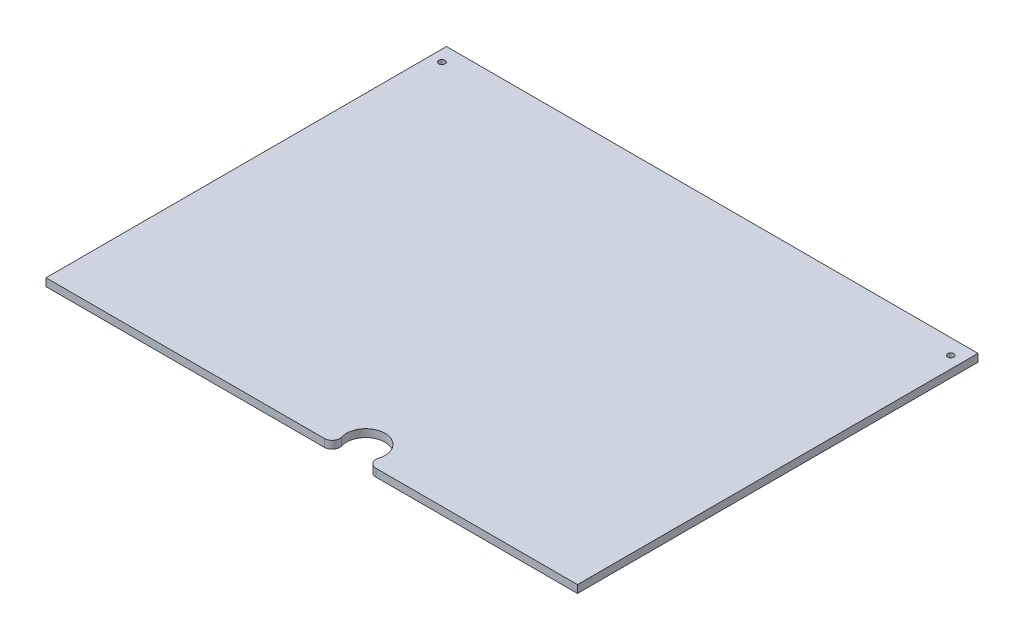
ISO-10303-21;
HEADER;
FILE_DESCRIPTION(('STEP AP214'),'2;1');
FILE_NAME('part.step','',(''),(''),'','','');
FILE_SCHEMA(('AUTOMOTIVE_DESIGN { 1 0 10303 214 1 1 1 1 }'));
ENDSEC;
DATA;
#1=APPLICATION_CONTEXT('core data for automotive mechanical design processes');
#2=APPLICATION_PROTOCOL_DEFINITION('international standard','automotive_design',2000,#1);
#3=PRODUCT_CONTEXT('',#1,'mechanical');
#4=PRODUCT('Part','Part','',(#3));
#5=PRODUCT_RELATED_PRODUCT_CATEGORY('part','',(#4));
#6=PRODUCT_DEFINITION_FORMATION('','',#4);
#7=PRODUCT_DEFINITION_CONTEXT('part definition',#1,'design');
#8=PRODUCT_DEFINITION('design','',#6,#7);
#9=PRODUCT_DEFINITION_SHAPE('','',#8);
#10=(LENGTH_UNIT() NAMED_UNIT(*) SI_UNIT(.MILLI.,.METRE.));
#11=(NAMED_UNIT(*) PLANE_ANGLE_UNIT() SI_UNIT($,.RADIAN.));
#12=(NAMED_UNIT(*) SI_UNIT($,.STERADIAN.) SOLID_ANGLE_UNIT());
#13=UNCERTAINTY_MEASURE_WITH_UNIT(LENGTH_MEASURE(1.E-05),#10,'distance_accuracy_value','');
#14=(GEOMETRIC_REPRESENTATION_CONTEXT(3) GLOBAL_UNCERTAINTY_ASSIGNED_CONTEXT((#13)) GLOBAL_UNIT_ASSIGNED_CONTEXT((#10,
#11,#12)) REPRESENTATION_CONTEXT('',''));
#15=CARTESIAN_POINT('',(0.,0.,0.));
#16=DIRECTION('',(0.,0.,1.));
#17=DIRECTION('',(1.,0.,0.));
#18=AXIS2_PLACEMENT_3D('',#15,#16,#17);
#19=CARTESIAN_POINT('',(0.,3.175,0.));
#20=DIRECTION('',(0.,1.,0.));
#21=DIRECTION('',(0.,0.,1.));
#22=AXIS2_PLACEMENT_3D('',#19,#20,#21);
#23=PLANE('',#22);
#24=CARTESIAN_POINT('',(-209.857991339845,3.175,-152.080938245262));
#25=DIRECTION('',(0.,-1.,0.));
#26=DIRECTION('',(0.,0.,-1.));
#27=AXIS2_PLACEMENT_3D('',#24,#25,#26);
#28=CIRCLE('',#27,2.5527);
#29=CARTESIAN_POINT('',(-209.857991339845,3.175,-154.633638245262));
#30=VERTEX_POINT('',#29);
#31=EDGE_CURVE('E167',#30,#30,#28,.T.);
#32=ORIENTED_EDGE('',*,*,#31,.T.);
#33=EDGE_LOOP('',(#32));
#34=FACE_BOUND('',#33,.T.);
#35=CARTESIAN_POINT('',(209.241862184933,3.175,-152.431331638124));
#36=DIRECTION('',(0.,-1.,0.));
#37=DIRECTION('',(0.,0.,-1.));
#38=AXIS2_PLACEMENT_3D('',#35,#36,#37);
#39=CIRCLE('',#38,2.5527);
#40=CARTESIAN_POINT('',(209.241862184933,3.175,-154.984031638124));
#41=VERTEX_POINT('',#40);
#42=EDGE_CURVE('E170',#41,#41,#39,.T.);
#43=ORIENTED_EDGE('',*,*,#42,.T.);
#44=EDGE_LOOP('',(#43));
#45=FACE_BOUND('',#44,.T.);
#46=CARTESIAN_POINT('',(31.6966537955674,3.175,152.273));
#47=DIRECTION('',(0.,-1.,0.));
#48=DIRECTION('',(0.,0.,-1.));
#49=AXIS2_PLACEMENT_3D('',#46,#47,#48);
#50=CIRCLE('',#49,15.875);
#51=CARTESIAN_POINT('',(16.5107463918757,3.175,156.89942857143));
#52=VERTEX_POINT('',#51);
#53=CARTESIAN_POINT('',(46.8825611992606,3.175,156.89942857143));
#54=VERTEX_POINT('',#53);
#55=EDGE_CURVE('E173',#52,#54,#50,.T.);
#56=ORIENTED_EDGE('',*,*,#55,.T.);
#57=CARTESIAN_POINT('',(52.956924160743,3.175,158.75));
#58=DIRECTION('',(0.,-1.,0.));
#59=DIRECTION('',(0.,0.,-1.));
#60=AXIS2_PLACEMENT_3D('',#57,#58,#59);
#61=CIRCLE('',#60,6.35);
#62=CARTESIAN_POINT('',(52.956924160743,3.175,165.1));
#63=VERTEX_POINT('',#62);
#64=EDGE_CURVE('E20',#63,#54,#61,.T.);
#65=ORIENTED_EDGE('',*,*,#64,.F.);
#66=DIRECTION('',(1.,0.,0.));
#67=VECTOR('',#66,1.);
#68=CARTESIAN_POINT('',(-219.075,3.175,165.1));
#69=LINE('',#68,#67);
#70=CARTESIAN_POINT('',(219.075,3.175,165.1));
#71=VERTEX_POINT('',#70);
#72=EDGE_CURVE('E61',#71,#63,#69,.F.);
#73=ORIENTED_EDGE('',*,*,#72,.F.);
#74=DIRECTION('',(0.,0.,-1.));
#75=VECTOR('',#74,1.);
#76=CARTESIAN_POINT('',(219.075,3.175,165.1));
#77=LINE('',#76,#75);
#78=CARTESIAN_POINT('',(219.075,3.175,-165.1));
#79=VERTEX_POINT('',#78);
#80=EDGE_CURVE('E69',#79,#71,#77,.F.);
#81=ORIENTED_EDGE('',*,*,#80,.F.);
#82=DIRECTION('',(-1.,0.,0.));
#83=VECTOR('',#82,1.);
#84=CARTESIAN_POINT('',(219.075,3.175,-165.1));
#85=LINE('',#84,#83);
#86=CARTESIAN_POINT('',(-219.075,3.175,-165.1));
#87=VERTEX_POINT('',#86);
#88=EDGE_CURVE('E130',#87,#79,#85,.F.);
#89=ORIENTED_EDGE('',*,*,#88,.F.);
#90=DIRECTION('',(0.,0.,1.));
#91=VECTOR('',#90,1.);
#92=CARTESIAN_POINT('',(-219.075,3.175,-165.1));
#93=LINE('',#92,#91);
#94=CARTESIAN_POINT('',(-219.075,3.175,165.1));
#95=VERTEX_POINT('',#94);
#96=EDGE_CURVE('E123',#95,#87,#93,.F.);
#97=ORIENTED_EDGE('',*,*,#96,.F.);
#98=DIRECTION('',(1.,0.,0.));
#99=VECTOR('',#98,1.);
#100=CARTESIAN_POINT('',(-219.075,3.175,165.1));
#101=LINE('',#100,#99);
#102=CARTESIAN_POINT('',(10.4363834303969,3.175,165.1));
#103=VERTEX_POINT('',#102);
#104=EDGE_CURVE('E94',#103,#95,#101,.F.);
#105=ORIENTED_EDGE('',*,*,#104,.F.);
#106=CARTESIAN_POINT('',(10.4363834303969,3.175,158.75));
#107=DIRECTION('',(0.,1.,0.));
#108=DIRECTION('',(0.,0.,1.));
#109=AXIS2_PLACEMENT_3D('',#106,#107,#108);
#110=CIRCLE('',#109,6.35);
#111=EDGE_CURVE('E175',#52,#103,#110,.F.);
#112=ORIENTED_EDGE('',*,*,#111,.F.);
#113=EDGE_LOOP('',(#56,#65,#73,#81,#89,#97,#105,#112));
#114=FACE_BOUND('',#113,.T.);
#115=ADVANCED_FACE('F17',(#34,#45,#114),#23,.T.);
#116=CARTESIAN_POINT('',(52.956924160743,11.45286,158.75));
#117=DIRECTION('',(0.,-1.,0.));
#118=DIRECTION('',(0.,0.,-1.));
#119=AXIS2_PLACEMENT_3D('',#116,#117,#118);
#120=CYLINDRICAL_SURFACE('',#119,6.35);
#121=DIRECTION('',(0.,-1.,0.));
#122=VECTOR('',#121,1.);
#123=CARTESIAN_POINT('',(46.882561199257,-3.175,156.899428571432));
#124=LINE('',#123,#122);
#125=CARTESIAN_POINT('',(46.8825611992606,-3.175,156.89942857143));
#126=VERTEX_POINT('',#125);
#127=EDGE_CURVE('E177',#54,#126,#124,.T.);
#128=ORIENTED_EDGE('',*,*,#127,.T.);
#129=CARTESIAN_POINT('',(52.956924160743,-3.175,158.75));
#130=DIRECTION('',(0.,-1.,0.));
#131=DIRECTION('',(0.,0.,-1.));
#132=AXIS2_PLACEMENT_3D('',#129,#130,#131);
#133=CIRCLE('',#132,6.35);
#134=CARTESIAN_POINT('',(52.956924160743,-3.175,165.1));
#135=VERTEX_POINT('',#134);
#136=EDGE_CURVE('E164',#126,#135,#133,.F.);
#137=ORIENTED_EDGE('',*,*,#136,.T.);
#138=DIRECTION('',(0.,1.,0.));
#139=VECTOR('',#138,1.);
#140=CARTESIAN_POINT('',(52.956924160743,-3.175,165.1));
#141=LINE('',#140,#139);
#142=EDGE_CURVE('E142',#63,#135,#141,.F.);
#143=ORIENTED_EDGE('',*,*,#142,.F.);
#144=ORIENTED_EDGE('',*,*,#64,.T.);
#145=EDGE_LOOP('',(#128,#137,#143,#144));
#146=FACE_BOUND('',#145,.T.);
#147=ADVANCED_FACE('F194',(#146),#120,.T.);
#148=CARTESIAN_POINT('',(-219.075,-3.175,165.1));
#149=DIRECTION('',(0.,0.,1.));
#150=DIRECTION('',(1.,0.,0.));
#151=AXIS2_PLACEMENT_3D('',#148,#149,#150);
#152=PLANE('',#151);
#153=ORIENTED_EDGE('',*,*,#72,.T.);
#154=ORIENTED_EDGE('',*,*,#142,.T.);
#155=DIRECTION('',(1.,0.,0.));
#156=VECTOR('',#155,1.);
#157=CARTESIAN_POINT('',(0.,-3.175,165.1));
#158=LINE('',#157,#156);
#159=CARTESIAN_POINT('',(219.075,-3.175,165.1));
#160=VERTEX_POINT('',#159);
#161=EDGE_CURVE('E135',#135,#160,#158,.T.);
#162=ORIENTED_EDGE('',*,*,#161,.T.);
#163=DIRECTION('',(0.,1.,0.));
#164=VECTOR('',#163,1.);
#165=CARTESIAN_POINT('',(219.075,-3.175,165.1));
#166=LINE('',#165,#164);
#167=EDGE_CURVE('E138',#71,#160,#166,.F.);
#168=ORIENTED_EDGE('',*,*,#167,.F.);
#169=EDGE_LOOP('',(#153,#154,#162,#168));
#170=FACE_BOUND('',#169,.T.);
#171=ADVANCED_FACE('F190',(#170),#152,.T.);
#172=CARTESIAN_POINT('',(219.075,-3.175,165.1));
#173=DIRECTION('',(1.,0.,0.));
#174=DIRECTION('',(0.,0.,-1.));
#175=AXIS2_PLACEMENT_3D('',#172,#173,#174);
#176=PLANE('',#175);
#177=ORIENTED_EDGE('',*,*,#167,.T.);
#178=DIRECTION('',(0.,0.,1.));
#179=VECTOR('',#178,1.);
#180=CARTESIAN_POINT('',(219.075,-3.175,0.));
#181=LINE('',#180,#179);
#182=CARTESIAN_POINT('',(219.075,-3.175,-165.1));
#183=VERTEX_POINT('',#182);
#184=EDGE_CURVE('E115',#160,#183,#181,.F.);
#185=ORIENTED_EDGE('',*,*,#184,.T.);
#186=DIRECTION('',(0.,1.,0.));
#187=VECTOR('',#186,1.);
#188=CARTESIAN_POINT('',(219.075,-3.175,-165.1));
#189=LINE('',#188,#187);
#190=EDGE_CURVE('E128',#79,#183,#189,.F.);
#191=ORIENTED_EDGE('',*,*,#190,.F.);
#192=ORIENTED_EDGE('',*,*,#80,.T.);
#193=EDGE_LOOP('',(#177,#185,#191,#192));
#194=FACE_BOUND('',#193,.T.);
#195=ADVANCED_FACE('F235',(#194),#176,.T.);
#196=CARTESIAN_POINT('',(219.075,-3.175,-165.1));
#197=DIRECTION('',(0.,0.,-1.));
#198=DIRECTION('',(-1.,0.,0.));
#199=AXIS2_PLACEMENT_3D('',#196,#197,#198);
#200=PLANE('',#199);
#201=ORIENTED_EDGE('',*,*,#190,.T.);
#202=DIRECTION('',(1.,0.,0.));
#203=VECTOR('',#202,1.);
#204=CARTESIAN_POINT('',(0.,-3.175,-165.1));
#205=LINE('',#204,#203);
#206=CARTESIAN_POINT('',(-219.075,-3.175,-165.1));
#207=VERTEX_POINT('',#206);
#208=EDGE_CURVE('E113',#183,#207,#205,.F.);
#209=ORIENTED_EDGE('',*,*,#208,.T.);
#210=DIRECTION('',(0.,1.,0.));
#211=VECTOR('',#210,1.);
#212=CARTESIAN_POINT('',(-219.075,-3.175,-165.1));
#213=LINE('',#212,#211);
#214=EDGE_CURVE('E112',#87,#207,#213,.F.);
#215=ORIENTED_EDGE('',*,*,#214,.F.);
#216=ORIENTED_EDGE('',*,*,#88,.T.);
#217=EDGE_LOOP('',(#201,#209,#215,#216));
#218=FACE_BOUND('',#217,.T.);
#219=ADVANCED_FACE('F234',(#218),#200,.T.);
#220=CARTESIAN_POINT('',(-219.075,-3.175,-165.1));
#221=DIRECTION('',(-1.,0.,0.));
#222=DIRECTION('',(0.,0.,1.));
#223=AXIS2_PLACEMENT_3D('',#220,#221,#222);
#224=PLANE('',#223);
#225=ORIENTED_EDGE('',*,*,#214,.T.);
#226=DIRECTION('',(0.,0.,1.));
#227=VECTOR('',#226,1.);
#228=CARTESIAN_POINT('',(-219.075,-3.175,0.));
#229=LINE('',#228,#227);
#230=CARTESIAN_POINT('',(-219.075,-3.175,165.1));
#231=VERTEX_POINT('',#230);
#232=EDGE_CURVE('E105',#207,#231,#229,.T.);
#233=ORIENTED_EDGE('',*,*,#232,.T.);
#234=DIRECTION('',(0.,1.,0.));
#235=VECTOR('',#234,1.);
#236=CARTESIAN_POINT('',(-219.075,-3.175,165.1));
#237=LINE('',#236,#235);
#238=EDGE_CURVE('E89',#95,#231,#237,.F.);
#239=ORIENTED_EDGE('',*,*,#238,.F.);
#240=ORIENTED_EDGE('',*,*,#96,.T.);
#241=EDGE_LOOP('',(#225,#233,#239,#240));
#242=FACE_BOUND('',#241,.T.);
#243=ADVANCED_FACE('F110',(#242),#224,.T.);
#244=CARTESIAN_POINT('',(-219.075,-3.175,165.1));
#245=DIRECTION('',(0.,0.,1.));
#246=DIRECTION('',(1.,0.,0.));
#247=AXIS2_PLACEMENT_3D('',#244,#245,#246);
#248=PLANE('',#247);
#249=DIRECTION('',(1.,0.,0.));
#250=VECTOR('',#249,1.);
#251=CARTESIAN_POINT('',(0.,-3.175,165.1));
#252=LINE('',#251,#250);
#253=CARTESIAN_POINT('',(10.4363834303969,-3.175,165.1));
#254=VERTEX_POINT('',#253);
#255=EDGE_CURVE('E93',#231,#254,#252,.T.);
#256=ORIENTED_EDGE('',*,*,#255,.T.);
#257=DIRECTION('',(0.,1.,0.));
#258=VECTOR('',#257,1.);
#259=CARTESIAN_POINT('',(10.4363834303969,-11.45286,165.1));
#260=LINE('',#259,#258);
#261=EDGE_CURVE('E98',#103,#254,#260,.F.);
#262=ORIENTED_EDGE('',*,*,#261,.F.);
#263=ORIENTED_EDGE('',*,*,#104,.T.);
#264=ORIENTED_EDGE('',*,*,#238,.T.);
#265=EDGE_LOOP('',(#256,#262,#263,#264));
#266=FACE_BOUND('',#265,.T.);
#267=ADVANCED_FACE('F91',(#266),#248,.T.);
#268=CARTESIAN_POINT('',(10.4363834303969,-11.45286,158.75));
#269=DIRECTION('',(0.,1.,0.));
#270=DIRECTION('',(0.,0.,1.));
#271=AXIS2_PLACEMENT_3D('',#268,#269,#270);
#272=CYLINDRICAL_SURFACE('',#271,6.35);
#273=DIRECTION('',(0.,-1.,0.));
#274=VECTOR('',#273,1.);
#275=CARTESIAN_POINT('',(16.5107463918773,-3.175,156.899428571431));
#276=LINE('',#275,#274);
#277=CARTESIAN_POINT('',(16.5107463918757,-3.175,156.89942857143));
#278=VERTEX_POINT('',#277);
#279=EDGE_CURVE('E35',#278,#52,#276,.F.);
#280=ORIENTED_EDGE('',*,*,#279,.T.);
#281=ORIENTED_EDGE('',*,*,#111,.T.);
#282=ORIENTED_EDGE('',*,*,#261,.T.);
#283=CARTESIAN_POINT('',(10.4363834303969,-3.175,158.75));
#284=DIRECTION('',(0.,1.,0.));
#285=DIRECTION('',(0.,0.,1.));
#286=AXIS2_PLACEMENT_3D('',#283,#284,#285);
#287=CIRCLE('',#286,6.35);
#288=EDGE_CURVE('E108',#254,#278,#287,.T.);
#289=ORIENTED_EDGE('',*,*,#288,.T.);
#290=EDGE_LOOP('',(#280,#281,#282,#289));
#291=FACE_BOUND('',#290,.T.);
#292=ADVANCED_FACE('F198',(#291),#272,.T.);
#293=CARTESIAN_POINT('',(31.6966537955674,-3.175,152.273));
#294=DIRECTION('',(0.,-1.,0.));
#295=DIRECTION('',(0.,0.,-1.));
#296=AXIS2_PLACEMENT_3D('',#293,#294,#295);
#297=CYLINDRICAL_SURFACE('',#296,15.875);
#298=ORIENTED_EDGE('',*,*,#279,.F.);
#299=CARTESIAN_POINT('',(31.6966537955674,-3.175,152.273));
#300=DIRECTION('',(0.,-1.,0.));
#301=DIRECTION('',(0.,0.,-1.));
#302=AXIS2_PLACEMENT_3D('',#299,#300,#301);
#303=CIRCLE('',#302,15.875);
#304=EDGE_CURVE('E161',#278,#126,#303,.T.);
#305=ORIENTED_EDGE('',*,*,#304,.T.);
#306=ORIENTED_EDGE('',*,*,#127,.F.);
#307=ORIENTED_EDGE('',*,*,#55,.F.);
#308=EDGE_LOOP('',(#298,#305,#306,#307));
#309=FACE_BOUND('',#308,.T.);
#310=ADVANCED_FACE('F197',(#309),#297,.F.);
#311=CARTESIAN_POINT('',(209.241862184933,-3.175,-152.431331638124));
#312=DIRECTION('',(0.,-1.,0.));
#313=DIRECTION('',(0.,0.,-1.));
#314=AXIS2_PLACEMENT_3D('',#311,#312,#313);
#315=CYLINDRICAL_SURFACE('',#314,2.5527);
#316=ORIENTED_EDGE('',*,*,#42,.F.);
#317=EDGE_LOOP('',(#316));
#318=FACE_BOUND('',#317,.T.);
#319=CARTESIAN_POINT('',(209.241862184933,-3.175,-152.431331638124));
#320=DIRECTION('',(0.,-1.,0.));
#321=DIRECTION('',(0.,0.,-1.));
#322=AXIS2_PLACEMENT_3D('',#319,#320,#321);
#323=CIRCLE('',#322,2.5527);
#324=CARTESIAN_POINT('',(209.241862184933,-3.175,-154.984031638124));
#325=VERTEX_POINT('',#324);
#326=EDGE_CURVE('E26',#325,#325,#323,.T.);
#327=ORIENTED_EDGE('',*,*,#326,.T.);
#328=EDGE_LOOP('',(#327));
#329=FACE_BOUND('',#328,.T.);
#330=ADVANCED_FACE('F206',(#318,#329),#315,.F.);
#331=CARTESIAN_POINT('',(-209.857991339845,-3.175,-152.080938245262));
#332=DIRECTION('',(0.,-1.,0.));
#333=DIRECTION('',(0.,0.,-1.));
#334=AXIS2_PLACEMENT_3D('',#331,#332,#333);
#335=CYLINDRICAL_SURFACE('',#334,2.5527);
#336=ORIENTED_EDGE('',*,*,#31,.F.);
#337=EDGE_LOOP('',(#336));
#338=FACE_BOUND('',#337,.T.);
#339=CARTESIAN_POINT('',(-209.857991339845,-3.175,-152.080938245262));
#340=DIRECTION('',(0.,-1.,0.));
#341=DIRECTION('',(0.,0.,-1.));
#342=AXIS2_PLACEMENT_3D('',#339,#340,#341);
#343=CIRCLE('',#342,2.5527);
#344=CARTESIAN_POINT('',(-209.857991339845,-3.175,-154.633638245262));
#345=VERTEX_POINT('',#344);
#346=EDGE_CURVE('E11',#345,#345,#343,.T.);
#347=ORIENTED_EDGE('',*,*,#346,.T.);
#348=EDGE_LOOP('',(#347));
#349=FACE_BOUND('',#348,.T.);
#350=ADVANCED_FACE('F210',(#338,#349),#335,.F.);
#351=CARTESIAN_POINT('',(0.,-3.175,0.));
#352=DIRECTION('',(0.,1.,0.));
#353=DIRECTION('',(0.,0.,1.));
#354=AXIS2_PLACEMENT_3D('',#351,#352,#353);
#355=PLANE('',#354);
#356=ORIENTED_EDGE('',*,*,#346,.F.);
#357=EDGE_LOOP('',(#356));
#358=FACE_BOUND('',#357,.T.);
#359=ORIENTED_EDGE('',*,*,#326,.F.);
#360=EDGE_LOOP('',(#359));
#361=FACE_BOUND('',#360,.T.);
#362=ORIENTED_EDGE('',*,*,#288,.F.);
#363=ORIENTED_EDGE('',*,*,#255,.F.);
#364=ORIENTED_EDGE('',*,*,#232,.F.);
#365=ORIENTED_EDGE('',*,*,#208,.F.);
#366=ORIENTED_EDGE('',*,*,#184,.F.);
#367=ORIENTED_EDGE('',*,*,#161,.F.);
#368=ORIENTED_EDGE('',*,*,#136,.F.);
#369=ORIENTED_EDGE('',*,*,#304,.F.);
#370=EDGE_LOOP('',(#362,#363,#364,#365,#366,#367,#368,#369));
#371=FACE_BOUND('',#370,.T.);
#372=ADVANCED_FACE('F103',(#358,#361,#371),#355,.F.);
#373=CLOSED_SHELL('',(#115,#147,#171,#195,#219,#243,#267,#292,#310,#330,#350,#372));
#374=MANIFOLD_SOLID_BREP('B1',#373);
#375=ADVANCED_BREP_SHAPE_REPRESENTATION('',(#18,#374),#14);
#376=SHAPE_DEFINITION_REPRESENTATION(#9,#375);
ENDSEC;
END-ISO-10303-21;
